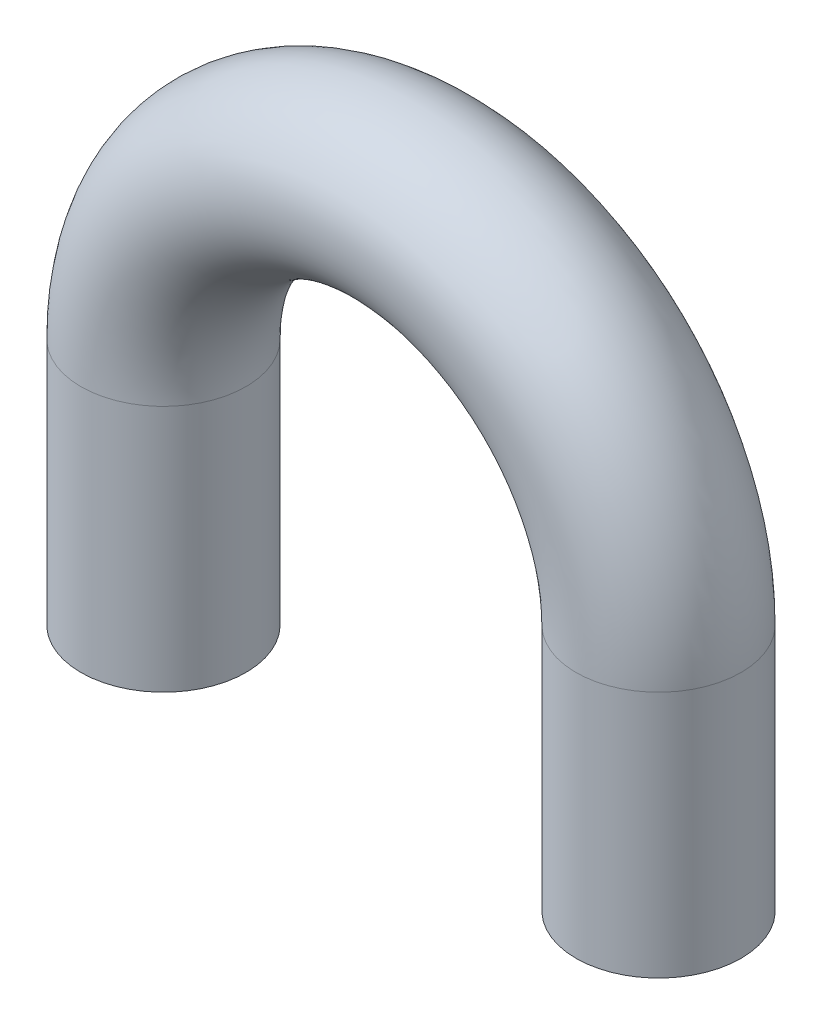
ISO-10303-21;
HEADER;
FILE_DESCRIPTION(('STEP AP214'),'2;1');
FILE_NAME('part.step','',(''),(''),'','','');
FILE_SCHEMA(('AUTOMOTIVE_DESIGN { 1 0 10303 214 1 1 1 1 }'));
ENDSEC;
DATA;
#1=APPLICATION_CONTEXT('core data for automotive mechanical design processes');
#2=APPLICATION_PROTOCOL_DEFINITION('international standard','automotive_design',2000,#1);
#3=PRODUCT_CONTEXT('',#1,'mechanical');
#4=PRODUCT('Part','Part','',(#3));
#5=PRODUCT_RELATED_PRODUCT_CATEGORY('part','',(#4));
#6=PRODUCT_DEFINITION_FORMATION('','',#4);
#7=PRODUCT_DEFINITION_CONTEXT('part definition',#1,'design');
#8=PRODUCT_DEFINITION('design','',#6,#7);
#9=PRODUCT_DEFINITION_SHAPE('','',#8);
#10=(LENGTH_UNIT() NAMED_UNIT(*) SI_UNIT(.MILLI.,.METRE.));
#11=(NAMED_UNIT(*) PLANE_ANGLE_UNIT() SI_UNIT($,.RADIAN.));
#12=(NAMED_UNIT(*) SI_UNIT($,.STERADIAN.) SOLID_ANGLE_UNIT());
#13=UNCERTAINTY_MEASURE_WITH_UNIT(LENGTH_MEASURE(1.E-05),#10,'distance_accuracy_value','');
#14=(GEOMETRIC_REPRESENTATION_CONTEXT(3) GLOBAL_UNCERTAINTY_ASSIGNED_CONTEXT((#13)) GLOBAL_UNIT_ASSIGNED_CONTEXT((#10,
#11,#12)) REPRESENTATION_CONTEXT('',''));
#15=CARTESIAN_POINT('',(0.,0.,0.));
#16=DIRECTION('',(0.,0.,1.));
#17=DIRECTION('',(1.,0.,0.));
#18=AXIS2_PLACEMENT_3D('',#15,#16,#17);
#19=CARTESIAN_POINT('',(-3.,3.,0.));
#20=DIRECTION('',(0.,-1.,0.));
#21=DIRECTION('',(1.,0.,0.));
#22=AXIS2_PLACEMENT_3D('',#19,#20,#21);
#23=CYLINDRICAL_SURFACE('',#22,1.);
#24=CARTESIAN_POINT('',(-3.,3.,0.));
#25=DIRECTION('',(0.,-1.,0.));
#26=DIRECTION('',(0.,0.,1.));
#27=AXIS2_PLACEMENT_3D('',#24,#25,#26);
#28=CIRCLE('',#27,1.);
#29=CARTESIAN_POINT('',(-4.,3.,0.));
#30=VERTEX_POINT('',#29);
#31=EDGE_CURVE('E40',#30,#30,#28,.T.);
#32=ORIENTED_EDGE('',*,*,#31,.T.);
#33=EDGE_LOOP('',(#32));
#34=FACE_BOUND('',#33,.T.);
#35=CARTESIAN_POINT('',(-3.,0.,0.));
#36=DIRECTION('',(0.,-1.,0.));
#37=DIRECTION('',(0.,0.,1.));
#38=AXIS2_PLACEMENT_3D('',#35,#36,#37);
#39=CIRCLE('',#38,1.);
#40=CARTESIAN_POINT('',(-3.,0.,1.));
#41=VERTEX_POINT('',#40);
#42=EDGE_CURVE('E10',#41,#41,#39,.T.);
#43=ORIENTED_EDGE('',*,*,#42,.F.);
#44=EDGE_LOOP('',(#43));
#45=FACE_BOUND('',#44,.T.);
#46=ADVANCED_FACE('F34',(#34,#45),#23,.T.);
#47=CARTESIAN_POINT('',(0.,3.,0.));
#48=DIRECTION('',(0.,0.,1.));
#49=DIRECTION('',(1.,0.,0.));
#50=AXIS2_PLACEMENT_3D('',#47,#48,#49);
#51=TOROIDAL_SURFACE('',#50,3.,1.);
#52=CARTESIAN_POINT('',(3.,3.,0.));
#53=DIRECTION('',(0.,1.,0.));
#54=DIRECTION('',(0.,0.,1.));
#55=AXIS2_PLACEMENT_3D('',#52,#53,#54);
#56=CIRCLE('',#55,1.);
#57=CARTESIAN_POINT('',(4.,3.,0.));
#58=VERTEX_POINT('',#57);
#59=EDGE_CURVE('E44',#58,#58,#56,.T.);
#60=CARTESIAN_POINT('',(0.,3.,0.));
#61=DIRECTION('',(0.,0.,1.));
#62=DIRECTION('',(1.,0.,0.));
#63=AXIS2_PLACEMENT_3D('',#60,#61,#62);
#64=CIRCLE('',#63,4.);
#65=EDGE_CURVE('',#58,#30,#64,.T.);
#66=ORIENTED_EDGE('',*,*,#59,.T.);
#67=ORIENTED_EDGE('',*,*,#31,.F.);
#68=ORIENTED_EDGE('',*,*,#65,.T.);
#69=ORIENTED_EDGE('',*,*,#65,.F.);
#70=EDGE_LOOP('',(#66,#68,#67,#69));
#71=FACE_BOUND('',#70,.T.);
#72=ADVANCED_FACE('F66',(#71),#51,.T.);
#73=CARTESIAN_POINT('',(3.,3.,0.));
#74=DIRECTION('',(0.,-1.,0.));
#75=DIRECTION('',(1.,0.,0.));
#76=AXIS2_PLACEMENT_3D('',#73,#74,#75);
#77=CYLINDRICAL_SURFACE('',#76,1.);
#78=ORIENTED_EDGE('',*,*,#59,.F.);
#79=EDGE_LOOP('',(#78));
#80=FACE_BOUND('',#79,.T.);
#81=CARTESIAN_POINT('',(3.,0.,0.));
#82=DIRECTION('',(0.,1.,0.));
#83=DIRECTION('',(0.,0.,1.));
#84=AXIS2_PLACEMENT_3D('',#81,#82,#83);
#85=CIRCLE('',#84,1.);
#86=CARTESIAN_POINT('',(3.,0.,1.));
#87=VERTEX_POINT('',#86);
#88=EDGE_CURVE('E48',#87,#87,#85,.T.);
#89=ORIENTED_EDGE('',*,*,#88,.T.);
#90=EDGE_LOOP('',(#89));
#91=FACE_BOUND('',#90,.T.);
#92=ADVANCED_FACE('F54',(#80,#91),#77,.T.);
#93=CARTESIAN_POINT('',(-3.,0.,0.));
#94=DIRECTION('',(0.,-1.,0.));
#95=DIRECTION('',(0.,0.,1.));
#96=AXIS2_PLACEMENT_3D('',#93,#94,#95);
#97=PLANE('',#96);
#98=ORIENTED_EDGE('',*,*,#42,.T.);
#99=EDGE_LOOP('',(#98));
#100=FACE_BOUND('',#99,.T.);
#101=ADVANCED_FACE('F58',(#100),#97,.T.);
#102=CARTESIAN_POINT('',(3.,0.,0.));
#103=DIRECTION('',(0.,1.,0.));
#104=DIRECTION('',(0.,0.,1.));
#105=AXIS2_PLACEMENT_3D('',#102,#103,#104);
#106=PLANE('',#105);
#107=ORIENTED_EDGE('',*,*,#88,.F.);
#108=EDGE_LOOP('',(#107));
#109=FACE_BOUND('',#108,.T.);
#110=ADVANCED_FACE('F56',(#109),#106,.F.);
#111=CLOSED_SHELL('',(#46,#72,#92,#101,#110));
#112=MANIFOLD_SOLID_BREP('B2',#111);
#113=ADVANCED_BREP_SHAPE_REPRESENTATION('',(#18,#112),#14);
#114=SHAPE_DEFINITION_REPRESENTATION(#9,#113);
ENDSEC;
END-ISO-10303-21;
